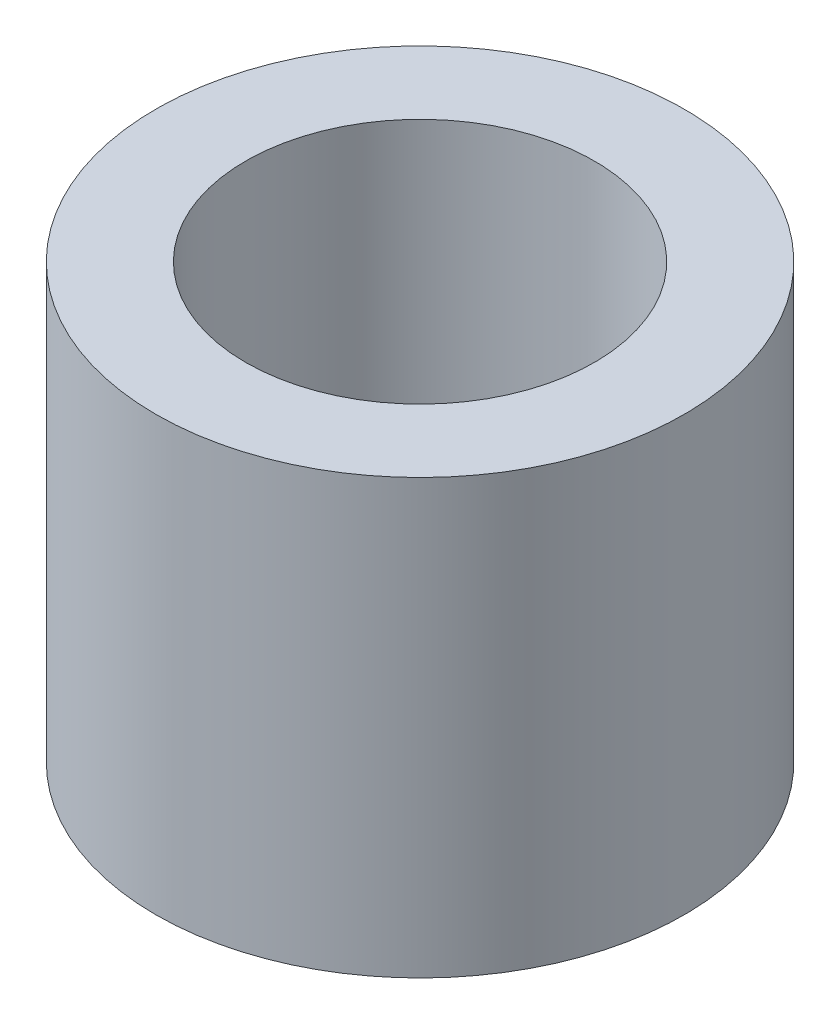
ISO-10303-21;
HEADER;
FILE_DESCRIPTION(('STEP AP214'),'2;1');
FILE_NAME('part.step','',(''),(''),'','','');
FILE_SCHEMA(('AUTOMOTIVE_DESIGN { 1 0 10303 214 1 1 1 1 }'));
ENDSEC;
DATA;
#1=APPLICATION_CONTEXT('core data for automotive mechanical design processes');
#2=APPLICATION_PROTOCOL_DEFINITION('international standard','automotive_design',2000,#1);
#3=PRODUCT_CONTEXT('',#1,'mechanical');
#4=PRODUCT('Part','Part','',(#3));
#5=PRODUCT_RELATED_PRODUCT_CATEGORY('part','',(#4));
#6=PRODUCT_DEFINITION_FORMATION('','',#4);
#7=PRODUCT_DEFINITION_CONTEXT('part definition',#1,'design');
#8=PRODUCT_DEFINITION('design','',#6,#7);
#9=PRODUCT_DEFINITION_SHAPE('','',#8);
#10=(LENGTH_UNIT() NAMED_UNIT(*) SI_UNIT(.MILLI.,.METRE.));
#11=(NAMED_UNIT(*) PLANE_ANGLE_UNIT() SI_UNIT($,.RADIAN.));
#12=(NAMED_UNIT(*) SI_UNIT($,.STERADIAN.) SOLID_ANGLE_UNIT());
#13=UNCERTAINTY_MEASURE_WITH_UNIT(LENGTH_MEASURE(1.E-05),#10,'distance_accuracy_value','');
#14=(GEOMETRIC_REPRESENTATION_CONTEXT(3) GLOBAL_UNCERTAINTY_ASSIGNED_CONTEXT((#13)) GLOBAL_UNIT_ASSIGNED_CONTEXT((#10,
#11,#12)) REPRESENTATION_CONTEXT('',''));
#15=CARTESIAN_POINT('',(0.,0.,0.));
#16=DIRECTION('',(0.,0.,1.));
#17=DIRECTION('',(1.,0.,0.));
#18=AXIS2_PLACEMENT_3D('',#15,#16,#17);
#19=CARTESIAN_POINT('',(0.,4.1,0.));
#20=DIRECTION('',(0.,1.,0.));
#21=DIRECTION('',(0.,0.,1.));
#22=AXIS2_PLACEMENT_3D('',#19,#20,#21);
#23=PLANE('',#22);
#24=CARTESIAN_POINT('',(0.,4.1,0.));
#25=DIRECTION('',(0.,1.,0.));
#26=DIRECTION('',(0.,0.,1.));
#27=AXIS2_PLACEMENT_3D('',#24,#25,#26);
#28=CIRCLE('',#27,2.5);
#29=CARTESIAN_POINT('',(0.,4.1,2.5));
#30=VERTEX_POINT('',#29);
#31=EDGE_CURVE('E10',#30,#30,#28,.T.);
#32=ORIENTED_EDGE('',*,*,#31,.T.);
#33=EDGE_LOOP('',(#32));
#34=FACE_BOUND('',#33,.T.);
#35=CARTESIAN_POINT('',(0.,4.1,0.));
#36=DIRECTION('',(0.,1.,0.));
#37=DIRECTION('',(0.,0.,1.));
#38=AXIS2_PLACEMENT_3D('',#35,#36,#37);
#39=CIRCLE('',#38,1.65);
#40=CARTESIAN_POINT('',(0.,4.1,1.65));
#41=VERTEX_POINT('',#40);
#42=EDGE_CURVE('E44',#41,#41,#39,.T.);
#43=ORIENTED_EDGE('',*,*,#42,.F.);
#44=EDGE_LOOP('',(#43));
#45=FACE_BOUND('',#44,.T.);
#46=ADVANCED_FACE('F33',(#34,#45),#23,.T.);
#47=CARTESIAN_POINT('',(0.,0.,0.));
#48=DIRECTION('',(0.,1.,0.));
#49=DIRECTION('',(0.,0.,1.));
#50=AXIS2_PLACEMENT_3D('',#47,#48,#49);
#51=PLANE('',#50);
#52=CARTESIAN_POINT('',(0.,0.,0.));
#53=DIRECTION('',(0.,1.,0.));
#54=DIRECTION('',(0.,0.,1.));
#55=AXIS2_PLACEMENT_3D('',#52,#53,#54);
#56=CIRCLE('',#55,2.5);
#57=CARTESIAN_POINT('',(0.,0.,2.5));
#58=VERTEX_POINT('',#57);
#59=EDGE_CURVE('E37',#58,#58,#56,.T.);
#60=ORIENTED_EDGE('',*,*,#59,.F.);
#61=EDGE_LOOP('',(#60));
#62=FACE_BOUND('',#61,.T.);
#63=CARTESIAN_POINT('',(0.,0.,0.));
#64=DIRECTION('',(0.,1.,0.));
#65=DIRECTION('',(0.,0.,1.));
#66=AXIS2_PLACEMENT_3D('',#63,#64,#65);
#67=CIRCLE('',#66,1.65);
#68=CARTESIAN_POINT('',(0.,0.,1.65));
#69=VERTEX_POINT('',#68);
#70=EDGE_CURVE('E46',#69,#69,#67,.T.);
#71=ORIENTED_EDGE('',*,*,#70,.T.);
#72=EDGE_LOOP('',(#71));
#73=FACE_BOUND('',#72,.T.);
#74=ADVANCED_FACE('F56',(#62,#73),#51,.F.);
#75=CARTESIAN_POINT('',(0.,4.1,0.));
#76=DIRECTION('',(0.,-1.,0.));
#77=DIRECTION('',(0.,0.,-1.));
#78=AXIS2_PLACEMENT_3D('',#75,#76,#77);
#79=CYLINDRICAL_SURFACE('',#78,2.5);
#80=ORIENTED_EDGE('',*,*,#31,.F.);
#81=EDGE_LOOP('',(#80));
#82=FACE_BOUND('',#81,.T.);
#83=ORIENTED_EDGE('',*,*,#59,.T.);
#84=EDGE_LOOP('',(#83));
#85=FACE_BOUND('',#84,.T.);
#86=ADVANCED_FACE('F35',(#82,#85),#79,.T.);
#87=CARTESIAN_POINT('',(0.,4.1,0.));
#88=DIRECTION('',(0.,-1.,0.));
#89=DIRECTION('',(0.,0.,-1.));
#90=AXIS2_PLACEMENT_3D('',#87,#88,#89);
#91=CYLINDRICAL_SURFACE('',#90,1.65);
#92=ORIENTED_EDGE('',*,*,#42,.T.);
#93=EDGE_LOOP('',(#92));
#94=FACE_BOUND('',#93,.T.);
#95=ORIENTED_EDGE('',*,*,#70,.F.);
#96=EDGE_LOOP('',(#95));
#97=FACE_BOUND('',#96,.T.);
#98=ADVANCED_FACE('F52',(#94,#97),#91,.F.);
#99=CLOSED_SHELL('',(#46,#74,#86,#98));
#100=MANIFOLD_SOLID_BREP('B2',#99);
#101=ADVANCED_BREP_SHAPE_REPRESENTATION('',(#18,#100),#14);
#102=SHAPE_DEFINITION_REPRESENTATION(#9,#101);
ENDSEC;
END-ISO-10303-21;
